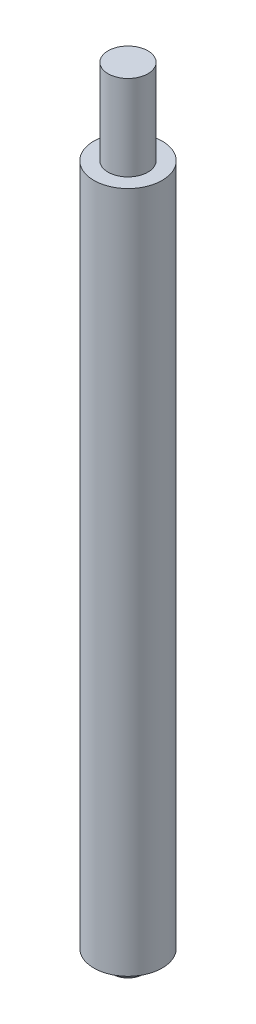
ISO-10303-21;
HEADER;
FILE_DESCRIPTION(('STEP AP214'),'2;1');
FILE_NAME('part.step','',(''),(''),'','','');
FILE_SCHEMA(('AUTOMOTIVE_DESIGN { 1 0 10303 214 1 1 1 1 }'));
ENDSEC;
DATA;
#1=APPLICATION_CONTEXT('core data for automotive mechanical design processes');
#2=APPLICATION_PROTOCOL_DEFINITION('international standard','automotive_design',2000,#1);
#3=PRODUCT_CONTEXT('',#1,'mechanical');
#4=PRODUCT('Part','Part','',(#3));
#5=PRODUCT_RELATED_PRODUCT_CATEGORY('part','',(#4));
#6=PRODUCT_DEFINITION_FORMATION('','',#4);
#7=PRODUCT_DEFINITION_CONTEXT('part definition',#1,'design');
#8=PRODUCT_DEFINITION('design','',#6,#7);
#9=PRODUCT_DEFINITION_SHAPE('','',#8);
#10=(LENGTH_UNIT() NAMED_UNIT(*) SI_UNIT(.MILLI.,.METRE.));
#11=(NAMED_UNIT(*) PLANE_ANGLE_UNIT() SI_UNIT($,.RADIAN.));
#12=(NAMED_UNIT(*) SI_UNIT($,.STERADIAN.) SOLID_ANGLE_UNIT());
#13=UNCERTAINTY_MEASURE_WITH_UNIT(LENGTH_MEASURE(1.E-05),#10,'distance_accuracy_value','');
#14=(GEOMETRIC_REPRESENTATION_CONTEXT(3) GLOBAL_UNCERTAINTY_ASSIGNED_CONTEXT((#13)) GLOBAL_UNIT_ASSIGNED_CONTEXT((#10,
#11,#12)) REPRESENTATION_CONTEXT('',''));
#15=CARTESIAN_POINT('',(0.,0.,0.));
#16=DIRECTION('',(0.,0.,1.));
#17=DIRECTION('',(1.,0.,0.));
#18=AXIS2_PLACEMENT_3D('',#15,#16,#17);
#19=CARTESIAN_POINT('',(-95.0254847573724,-22.870352222622,65.857887374483));
#20=DIRECTION('',(0.,1.,0.));
#21=DIRECTION('',(1.,0.,0.));
#22=AXIS2_PLACEMENT_3D('',#19,#20,#21);
#23=PLANE('',#22);
#24=CARTESIAN_POINT('',(-96.4993088756468,-22.8703522226221,69.5601967521078));
#25=CARTESIAN_POINT('',(-96.5119182137897,-22.8703522226221,69.6283260623005));
#26=CARTESIAN_POINT('',(-96.5126447232363,-22.8703522226221,69.6981958552125));
#27=CARTESIAN_POINT('',(-96.5013891171157,-22.8703522226221,69.766694150277));
#28=CARTESIAN_POINT('',(-96.4887204753378,-22.8703522226221,69.8437917630821));
#29=CARTESIAN_POINT('',(-96.4611145755664,-22.870352222622,69.9176780129497));
#30=CARTESIAN_POINT('',(-96.420124706718,-22.870352222622,69.9841938734458));
#31=CARTESIAN_POINT('',(-96.3791366268463,-22.870352222622,70.0507068308996));
#32=CARTESIAN_POINT('',(-96.3255494429534,-22.870352222622,70.1085782849579));
#33=CARTESIAN_POINT('',(-96.2623787646729,-22.870352222622,70.1545505995797));
#34=CARTESIAN_POINT('',(-96.1992097014033,-22.870352222622,70.2005217388812));
#35=CARTESIAN_POINT('',(-96.1276656605427,-22.870352222622,70.2337151931212));
#36=CARTESIAN_POINT('',(-96.0517731678732,-22.870352222622,70.2522624762642));
#37=CARTESIAN_POINT('',(-95.9758801597334,-22.870352222622,70.2708098853825));
#38=CARTESIAN_POINT('',(-95.8970901625167,-22.870352222622,70.2743561858513));
#39=CARTESIAN_POINT('',(-95.8198377448015,-22.870352222622,70.2627019582364));
#40=CARTESIAN_POINT('',(-95.7425825864555,-22.870352222622,70.2510473171724));
#41=CARTESIAN_POINT('',(-95.6683426806989,-22.870352222622,70.2244139848138));
#42=CARTESIAN_POINT('',(-95.6012964888886,-22.870352222622,70.1843015788666));
#43=CARTESIAN_POINT('',(-95.5342473279139,-22.870352222622,70.1441873965273));
#44=CARTESIAN_POINT('',(-95.4756747151514,-22.8703522226219,70.0913600744771));
#45=CARTESIAN_POINT('',(-95.4288752144154,-22.8703522226219,70.0287936940427));
#46=CARTESIAN_POINT('',(-95.3820744071731,-22.8703522226219,69.9662255669365));
#47=CARTESIAN_POINT('',(-95.3479421740751,-22.870352222622,69.8951141157626));
#48=CARTESIAN_POINT('',(-95.3283995403086,-22.870352222622,69.8194624435776));
#49=CARTESIAN_POINT('',(-95.3249030801038,-22.870352222622,69.8059272638069));
#50=CARTESIAN_POINT('',(-95.3218855975252,-22.870352222622,69.7922930437312));
#51=CARTESIAN_POINT('',(-95.3193485698068,-22.870352222622,69.7785851698655));
#52=B_SPLINE_CURVE_WITH_KNOTS('',3,(#24,#25,#26,#27,#28,#29,#30,#31,#32,#33,#34,#35,#36,#37,#38,
#39,#40,#41,#42,#43,#44,#45,#46,#47,#48,#49,#50,#51),.UNSPECIFIED.,.F.,.F.,(4,3,3,3,3,3,3,3,3,
4),(0.122913108078956,0.143738148295298,0.167177576761912,0.190615982229644,0.214053788475091,
0.237491753912711,0.260930550842927,0.284370385768576,0.307810875066373,0.312004718075993),.UNSPECIFIED.);
#53=CARTESIAN_POINT('',(-96.4993088913655,-22.8703522226221,69.5601967491986));
#54=VERTEX_POINT('',#53);
#55=CARTESIAN_POINT('',(-95.3193485186318,-22.8703522226219,69.7785851793369));
#56=VERTEX_POINT('',#55);
#57=EDGE_CURVE('P0_E11',#54,#56,#52,.T.);
#58=ORIENTED_EDGE('',*,*,#57,.T.);
#59=CARTESIAN_POINT('',(-95.3193485698068,-22.870352222622,69.7785851698655));
#60=CARTESIAN_POINT('',(-95.3077055531853,-22.8703522226221,69.7156765141528));
#61=CARTESIAN_POINT('',(-95.3061814341802,-22.8703522226221,69.6512166301712));
#62=CARTESIAN_POINT('',(-95.3149189937312,-22.8703522226221,69.5876592322493));
#63=CARTESIAN_POINT('',(-95.325560100473,-22.8703522226221,69.5102553471511));
#64=CARTESIAN_POINT('',(-95.3512176832514,-22.870352222622,69.4356697244079));
#65=CARTESIAN_POINT('',(-95.3904480919964,-22.870352222622,69.368100778288));
#66=CARTESIAN_POINT('',(-95.3983849296513,-22.870352222622,69.3544306745846));
#67=CARTESIAN_POINT('',(-95.4068465961956,-22.870352222622,69.3411006397397));
#68=CARTESIAN_POINT('',(-95.4158088196716,-22.870352222622,69.3281382906052));
#69=B_SPLINE_CURVE_WITH_KNOTS('',3,(#59,#60,#61,#62,#63,#64,#65,#66,#67,#68),.UNSPECIFIED.,.F.,
.F.,(4,3,3,4),(0.312004718075993,0.331251249565046,0.354690791783998,0.359432925431089),.UNSPECIFIED.);
#70=CARTESIAN_POINT('',(-95.4158088196715,-22.8703522226219,69.3281382906055));
#71=VERTEX_POINT('',#70);
#72=EDGE_CURVE('P0_E31',#56,#71,#69,.T.);
#73=ORIENTED_EDGE('',*,*,#72,.T.);
#74=CARTESIAN_POINT('',(-95.4158088196716,-22.870352222622,69.3281382906052));
#75=CARTESIAN_POINT('',(-95.4511432769944,-22.870352222622,69.2770329400729));
#76=CARTESIAN_POINT('',(-95.494259259355,-22.870352222622,69.2316434983798));
#77=CARTESIAN_POINT('',(-95.5436694952468,-22.870352222622,69.193662588086));
#78=CARTESIAN_POINT('',(-95.5787399073648,-22.870352222622,69.1667044861345));
#79=CARTESIAN_POINT('',(-95.616684221147,-22.870352222622,69.1437072351719));
#80=CARTESIAN_POINT('',(-95.6568101550883,-22.870352222622,69.1250905178238));
#81=CARTESIAN_POINT('',(-95.6969359145265,-22.870352222622,69.1064738814377));
#82=CARTESIAN_POINT('',(-95.7389976619471,-22.870352222622,69.0923516951816));
#83=CARTESIAN_POINT('',(-95.7822279534295,-22.870352222622,69.0829816673559));
#84=CARTESIAN_POINT('',(-95.8585815950127,-22.870352222622,69.0664322590197));
#85=CARTESIAN_POINT('',(-95.9374375560842,-22.870352222622,69.0649548718452));
#86=CARTESIAN_POINT('',(-96.0143575687471,-22.870352222622,69.0786324303592));
#87=CARTESIAN_POINT('',(-96.0912805858234,-22.870352222622,69.0923105231039));
#88=CARTESIAN_POINT('',(-96.1647962822391,-22.870352222622,69.1208831277757));
#89=CARTESIAN_POINT('',(-96.2307669669943,-22.870352222622,69.1627414203146));
#90=CARTESIAN_POINT('',(-96.2967406132708,-22.870352222622,69.2046015919339));
#91=CARTESIAN_POINT('',(-96.3539069678558,-22.870352222622,69.2589481447));
#92=CARTESIAN_POINT('',(-96.3990486065563,-22.870352222622,69.3227214617438));
#93=CARTESIAN_POINT('',(-96.4441913545155,-22.870352222622,69.3864963458796));
#94=CARTESIAN_POINT('',(-96.4764457188308,-22.8703522226221,69.45847914577));
#95=CARTESIAN_POINT('',(-96.4939963267554,-22.8703522226221,69.5346177246058));
#96=CARTESIAN_POINT('',(-96.4959544488244,-22.8703522226221,69.5431125090693));
#97=CARTESIAN_POINT('',(-96.4977253640026,-22.8703522226221,69.5516409060529));
#98=CARTESIAN_POINT('',(-96.4993088756468,-22.8703522226221,69.5601967521078));
#99=B_SPLINE_CURVE_WITH_KNOTS('',3,(#74,#75,#76,#77,#78,#79,#80,#81,#82,#83,#84,#85,#86,#87,#88,
#89,#90,#91,#92,#93,#94,#95,#96,#97,#98),.UNSPECIFIED.,.F.,.F.,(4,3,3,3,3,3,3,3,4),
(-0.0186963334957931,0.,0.0132702892216495,0.0265405207323562,0.0499784959518487,
0.0734173866335823,0.0968573295216872,0.120297848395959,0.122913108078956),.UNSPECIFIED.);
#100=EDGE_CURVE('P0_E52',#71,#54,#99,.T.);
#101=ORIENTED_EDGE('',*,*,#100,.T.);
#102=EDGE_LOOP('',(#58,#73,#101));
#103=FACE_BOUND('',#102,.T.);
#104=ADVANCED_FACE('P0_F17',(#103),#23,.T.);
#105=CARTESIAN_POINT('',(-95.4158088196716,-22.870352222622,69.3281382906052));
#106=CARTESIAN_POINT('',(-95.4158088196716,-34.870352222622,69.3281382906052));
#107=CARTESIAN_POINT('',(-95.4068465961956,-22.870352222622,69.3411006397397));
#108=CARTESIAN_POINT('',(-95.4068465961956,-34.870352222622,69.3411006397397));
#109=CARTESIAN_POINT('',(-95.3983849296513,-22.870352222622,69.3544306745846));
#110=CARTESIAN_POINT('',(-95.3983849296513,-34.870352222622,69.3544306745846));
#111=CARTESIAN_POINT('',(-95.3512176832514,-22.870352222622,69.4356697244079));
#112=CARTESIAN_POINT('',(-95.3512176832514,-34.870352222622,69.4356697244079));
#113=CARTESIAN_POINT('',(-95.325560100473,-22.8703522226221,69.5102553471511));
#114=CARTESIAN_POINT('',(-95.325560100473,-34.8703522226221,69.5102553471511));
#115=CARTESIAN_POINT('',(-95.3042775091502,-22.8703522226221,69.6650658657665));
#116=CARTESIAN_POINT('',(-95.3042775091502,-34.8703522226221,69.6650658657665));
#117=CARTESIAN_POINT('',(-95.3088570022515,-22.870352222622,69.7438111418945));
#118=CARTESIAN_POINT('',(-95.3088570022515,-34.870352222622,69.7438111418945));
#119=CARTESIAN_POINT('',(-95.3479421740751,-22.870352222622,69.8951141157626));
#120=CARTESIAN_POINT('',(-95.3479421740751,-34.870352222622,69.8951141157626));
#121=CARTESIAN_POINT('',(-95.3820744071731,-22.8703522226219,69.9662255669365));
#122=CARTESIAN_POINT('',(-95.3820744071731,-34.8703522226219,69.9662255669365));
#123=CARTESIAN_POINT('',(-95.4756747151514,-22.8703522226219,70.0913600744771));
#124=CARTESIAN_POINT('',(-95.4756747151514,-34.8703522226219,70.0913600744771));
#125=CARTESIAN_POINT('',(-95.5342473279139,-22.870352222622,70.1441873965273));
#126=CARTESIAN_POINT('',(-95.5342473279139,-34.870352222622,70.1441873965273));
#127=CARTESIAN_POINT('',(-95.6683426806989,-22.870352222622,70.2244139848138));
#128=CARTESIAN_POINT('',(-95.6683426806989,-34.870352222622,70.2244139848138));
#129=CARTESIAN_POINT('',(-95.7425825864555,-22.870352222622,70.2510473171724));
#130=CARTESIAN_POINT('',(-95.7425825864555,-34.870352222622,70.2510473171724));
#131=CARTESIAN_POINT('',(-95.8970901625167,-22.870352222622,70.2743561858513));
#132=CARTESIAN_POINT('',(-95.8970901625167,-34.870352222622,70.2743561858513));
#133=CARTESIAN_POINT('',(-95.9758801597334,-22.870352222622,70.2708098853825));
#134=CARTESIAN_POINT('',(-95.9758801597334,-34.870352222622,70.2708098853825));
#135=CARTESIAN_POINT('',(-96.1276656605427,-22.870352222622,70.2337151931212));
#136=CARTESIAN_POINT('',(-96.1276656605427,-34.870352222622,70.2337151931212));
#137=CARTESIAN_POINT('',(-96.1992097014033,-22.870352222622,70.2005217388812));
#138=CARTESIAN_POINT('',(-96.1992097014033,-34.870352222622,70.2005217388812));
#139=CARTESIAN_POINT('',(-96.3255494429534,-22.870352222622,70.1085782849579));
#140=CARTESIAN_POINT('',(-96.3255494429534,-34.870352222622,70.1085782849579));
#141=CARTESIAN_POINT('',(-96.3791366268463,-22.870352222622,70.0507068308996));
#142=CARTESIAN_POINT('',(-96.3791366268463,-34.870352222622,70.0507068308996));
#143=CARTESIAN_POINT('',(-96.4611145755664,-22.870352222622,69.9176780129497));
#144=CARTESIAN_POINT('',(-96.4611145755664,-34.870352222622,69.9176780129497));
#145=CARTESIAN_POINT('',(-96.4887204753378,-22.8703522226221,69.8437917630821));
#146=CARTESIAN_POINT('',(-96.4887204753378,-34.8703522226221,69.8437917630821));
#147=CARTESIAN_POINT('',(-96.5140582298894,-22.8703522226221,69.6895936711315));
#148=CARTESIAN_POINT('',(-96.5140582298894,-34.8703522226221,69.6895936711315));
#149=CARTESIAN_POINT('',(-96.5115467707269,-22.8703522226221,69.6107555921758));
#150=CARTESIAN_POINT('',(-96.5115467707269,-34.8703522226221,69.6107555921758));
#151=CARTESIAN_POINT('',(-96.4764457188308,-22.8703522226221,69.45847914577));
#152=CARTESIAN_POINT('',(-96.4764457188308,-34.8703522226221,69.45847914577));
#153=CARTESIAN_POINT('',(-96.4441913545155,-22.870352222622,69.3864963458796));
#154=CARTESIAN_POINT('',(-96.4441913545155,-34.870352222622,69.3864963458796));
#155=CARTESIAN_POINT('',(-96.3539069678558,-22.870352222622,69.2589481447));
#156=CARTESIAN_POINT('',(-96.3539069678558,-34.870352222622,69.2589481447));
#157=CARTESIAN_POINT('',(-96.2967406132708,-22.870352222622,69.2046015919339));
#158=CARTESIAN_POINT('',(-96.2967406132708,-34.870352222622,69.2046015919339));
#159=CARTESIAN_POINT('',(-96.1647962822391,-22.870352222622,69.1208831277757));
#160=CARTESIAN_POINT('',(-96.1647962822391,-34.870352222622,69.1208831277757));
#161=CARTESIAN_POINT('',(-96.0912805858234,-22.870352222622,69.0923105231039));
#162=CARTESIAN_POINT('',(-96.0912805858234,-34.870352222622,69.0923105231039));
#163=CARTESIAN_POINT('',(-95.9374375560842,-22.870352222622,69.0649548718452));
#164=CARTESIAN_POINT('',(-95.9374375560842,-34.870352222622,69.0649548718452));
#165=CARTESIAN_POINT('',(-95.8585815950127,-22.870352222622,69.0664322590197));
#166=CARTESIAN_POINT('',(-95.8585815950127,-34.870352222622,69.0664322590197));
#167=CARTESIAN_POINT('',(-95.7389976619471,-22.870352222622,69.0923516951816));
#168=CARTESIAN_POINT('',(-95.7389976619471,-34.870352222622,69.0923516951816));
#169=CARTESIAN_POINT('',(-95.6969359145265,-22.870352222622,69.1064738814377));
#170=CARTESIAN_POINT('',(-95.6969359145265,-34.870352222622,69.1064738814377));
#171=CARTESIAN_POINT('',(-95.616684221147,-22.870352222622,69.1437072351719));
#172=CARTESIAN_POINT('',(-95.616684221147,-34.870352222622,69.1437072351719));
#173=CARTESIAN_POINT('',(-95.5787399073648,-22.870352222622,69.1667044861345));
#174=CARTESIAN_POINT('',(-95.5787399073648,-34.870352222622,69.1667044861345));
#175=CARTESIAN_POINT('',(-95.5436694952468,-22.870352222622,69.193662588086));
#176=CARTESIAN_POINT('',(-95.5436694952468,-34.870352222622,69.193662588086));
#177=CARTESIAN_POINT('',(-95.494259259355,-22.870352222622,69.2316434983798));
#178=CARTESIAN_POINT('',(-95.494259259355,-34.870352222622,69.2316434983798));
#179=CARTESIAN_POINT('',(-95.4511432769944,-22.870352222622,69.2770329400729));
#180=CARTESIAN_POINT('',(-95.4511432769944,-34.870352222622,69.2770329400729));
#181=CARTESIAN_POINT('',(-95.4158088196716,-22.870352222622,69.3281382906052));
#182=CARTESIAN_POINT('',(-95.4158088196716,-34.870352222622,69.3281382906052));
#183=B_SPLINE_SURFACE_WITH_KNOTS('',3,1,((#105,#106),(#107,#108),(#109,#110),(#111,#112),(#113,
#114),(#115,#116),(#117,#118),(#119,#120),(#121,#122),(#123,#124),(#125,#126),(#127,#128),(#129,
#130),(#131,#132),(#133,#134),(#135,#136),(#137,#138),(#139,#140),(#141,#142),(#143,#144),(#145,
#146),(#147,#148),(#149,#150),(#151,#152),(#153,#154),(#155,#156),(#157,#158),(#159,#160),(#161,
#162),(#163,#164),(#165,#166),(#167,#168),(#169,#170),(#171,#172),(#173,#174),(#175,#176),(#177,
#178),(#179,#180),(#181,#182)),.UNSPECIFIED.,.T.,.F.,.F.,(4,2,2,2,2,2,2,2,2,2,2,2,2,2,2,2,2,3,
4),(2,2),(-0.359432925431089,-0.354690791783998,-0.331251249565046,-0.307810875066373,
-0.284370385768576,-0.260930550842927,-0.237491753912711,-0.214053788475091,-0.190615982229644,
-0.167177576761912,-0.143738148295298,-0.120297848395959,-0.0968573295216872,
-0.0734173866335823,-0.0499784959518487,-0.0265405207323562,-0.0132702892216495,0.,
0.0186963334957931),(0.,1.2),.UNSPECIFIED.);
#184=CARTESIAN_POINT('',(-95.4158088196716,-34.870352222622,69.3281382906052));
#185=CARTESIAN_POINT('',(-95.4068465961956,-34.870352222622,69.3411006397397));
#186=CARTESIAN_POINT('',(-95.3983849296513,-34.870352222622,69.3544306745846));
#187=CARTESIAN_POINT('',(-95.3904480919964,-34.870352222622,69.368100778288));
#188=CARTESIAN_POINT('',(-95.3512176832514,-34.870352222622,69.4356697244079));
#189=CARTESIAN_POINT('',(-95.325560100473,-34.8703522226221,69.5102553471511));
#190=CARTESIAN_POINT('',(-95.3149189937312,-34.8703522226221,69.5876592322493));
#191=CARTESIAN_POINT('',(-95.3042775091502,-34.8703522226221,69.6650658657665));
#192=CARTESIAN_POINT('',(-95.3088570022515,-34.870352222622,69.7438111418945));
#193=CARTESIAN_POINT('',(-95.3283995403086,-34.870352222622,69.8194624435776));
#194=CARTESIAN_POINT('',(-95.3479421740751,-34.870352222622,69.8951141157626));
#195=CARTESIAN_POINT('',(-95.3820744071731,-34.8703522226219,69.9662255669365));
#196=CARTESIAN_POINT('',(-95.4288752144154,-34.8703522226219,70.0287936940427));
#197=CARTESIAN_POINT('',(-95.4756747151514,-34.8703522226219,70.0913600744771));
#198=CARTESIAN_POINT('',(-95.5342473279139,-34.870352222622,70.1441873965273));
#199=CARTESIAN_POINT('',(-95.6012964888886,-34.870352222622,70.1843015788666));
#200=CARTESIAN_POINT('',(-95.6683426806989,-34.870352222622,70.2244139848138));
#201=CARTESIAN_POINT('',(-95.7425825864555,-34.870352222622,70.2510473171724));
#202=CARTESIAN_POINT('',(-95.8198377448015,-34.870352222622,70.2627019582364));
#203=CARTESIAN_POINT('',(-95.8970901625167,-34.870352222622,70.2743561858513));
#204=CARTESIAN_POINT('',(-95.9758801597334,-34.870352222622,70.2708098853825));
#205=CARTESIAN_POINT('',(-96.0517731678732,-34.870352222622,70.2522624762642));
#206=CARTESIAN_POINT('',(-96.1276656605427,-34.870352222622,70.2337151931212));
#207=CARTESIAN_POINT('',(-96.1992097014033,-34.870352222622,70.2005217388812));
#208=CARTESIAN_POINT('',(-96.2623787646729,-34.870352222622,70.1545505995797));
#209=CARTESIAN_POINT('',(-96.3255494429534,-34.870352222622,70.1085782849579));
#210=CARTESIAN_POINT('',(-96.3791366268463,-34.870352222622,70.0507068308996));
#211=CARTESIAN_POINT('',(-96.420124706718,-34.870352222622,69.9841938734458));
#212=CARTESIAN_POINT('',(-96.4611145755664,-34.870352222622,69.9176780129497));
#213=CARTESIAN_POINT('',(-96.4887204753378,-34.8703522226221,69.8437917630821));
#214=CARTESIAN_POINT('',(-96.5013891171157,-34.8703522226221,69.766694150277));
#215=CARTESIAN_POINT('',(-96.5140582298894,-34.8703522226221,69.6895936711315));
#216=CARTESIAN_POINT('',(-96.5115467707269,-34.8703522226221,69.6107555921758));
#217=CARTESIAN_POINT('',(-96.4939963267554,-34.8703522226221,69.5346177246058));
#218=CARTESIAN_POINT('',(-96.4764457188308,-34.8703522226221,69.45847914577));
#219=CARTESIAN_POINT('',(-96.4441913545155,-34.870352222622,69.3864963458796));
#220=CARTESIAN_POINT('',(-96.3990486065563,-34.870352222622,69.3227214617438));
#221=CARTESIAN_POINT('',(-96.3539069678558,-34.870352222622,69.2589481447));
#222=CARTESIAN_POINT('',(-96.2967406132708,-34.870352222622,69.2046015919339));
#223=CARTESIAN_POINT('',(-96.2307669669943,-34.870352222622,69.1627414203146));
#224=CARTESIAN_POINT('',(-96.1647962822391,-34.870352222622,69.1208831277757));
#225=CARTESIAN_POINT('',(-96.0912805858234,-34.870352222622,69.0923105231039));
#226=CARTESIAN_POINT('',(-96.0143575687471,-34.870352222622,69.0786324303592));
#227=CARTESIAN_POINT('',(-95.9374375560842,-34.870352222622,69.0649548718452));
#228=CARTESIAN_POINT('',(-95.8585815950127,-34.870352222622,69.0664322590197));
#229=CARTESIAN_POINT('',(-95.7822279534295,-34.870352222622,69.0829816673559));
#230=CARTESIAN_POINT('',(-95.7389976619471,-34.870352222622,69.0923516951816));
#231=CARTESIAN_POINT('',(-95.6969359145265,-34.870352222622,69.1064738814377));
#232=CARTESIAN_POINT('',(-95.6568101550883,-34.870352222622,69.1250905178238));
#233=CARTESIAN_POINT('',(-95.616684221147,-34.870352222622,69.1437072351719));
#234=CARTESIAN_POINT('',(-95.5787399073648,-34.870352222622,69.1667044861345));
#235=CARTESIAN_POINT('',(-95.5436694952468,-34.870352222622,69.193662588086));
#236=CARTESIAN_POINT('',(-95.494259259355,-34.870352222622,69.2316434983798));
#237=CARTESIAN_POINT('',(-95.4511432769944,-34.870352222622,69.2770329400729));
#238=CARTESIAN_POINT('',(-95.4158088196716,-34.870352222622,69.3281382906052));
#239=B_SPLINE_CURVE_WITH_KNOTS('',3,(#184,#185,#186,#187,#188,#189,#190,#191,#192,#193,#194,
#195,#196,#197,#198,#199,#200,#201,#202,#203,#204,#205,#206,#207,#208,#209,#210,#211,#212,#213,
#214,#215,#216,#217,#218,#219,#220,#221,#222,#223,#224,#225,#226,#227,#228,#229,#230,#231,#232,
#233,#234,#235,#236,#237,#238),.UNSPECIFIED.,.T.,.F.,(4,3,3,3,3,3,3,3,3,3,3,3,3,3,3,3,3,3,4),
(-0.359432925431089,-0.354690791783998,-0.331251249565046,-0.307810875066373,-0.284370385768576,
-0.260930550842927,-0.237491753912711,-0.214053788475091,-0.190615982229644,-0.167177576761912,
-0.143738148295298,-0.120297848395959,-0.0968573295216872,-0.0734173866335823,
-0.0499784959518487,-0.0265405207323562,-0.0132702892216495,0.,0.0186963334957931),.UNSPECIFIED.);
#240=CARTESIAN_POINT('',(-95.4158088196716,-34.870352222622,69.3281382906052));
#241=VERTEX_POINT('',#240);
#242=EDGE_CURVE('P0_E23',#241,#241,#239,.T.);
#243=ORIENTED_EDGE('',*,*,#242,.F.);
#244=EDGE_LOOP('',(#243));
#245=FACE_BOUND('',#244,.T.);
#246=ORIENTED_EDGE('',*,*,#100,.F.);
#247=ORIENTED_EDGE('',*,*,#72,.F.);
#248=ORIENTED_EDGE('',*,*,#57,.F.);
#249=EDGE_LOOP('',(#246,#247,#248));
#250=FACE_BOUND('',#249,.T.);
#251=ADVANCED_FACE('P0_F19',(#245,#250),#183,.T.);
#252=CARTESIAN_POINT('',(-95.1828071834293,-34.870352222622,65.9186913955159));
#253=DIRECTION('',(0.,1.,0.));
#254=DIRECTION('',(1.,0.,0.));
#255=AXIS2_PLACEMENT_3D('',#252,#253,#254);
#256=PLANE('',#255);
#257=ORIENTED_EDGE('',*,*,#242,.T.);
#258=EDGE_LOOP('',(#257));
#259=FACE_BOUND('',#258,.T.);
#260=ADVANCED_FACE('P0_F80',(#259),#256,.F.);
#261=CLOSED_SHELL('',(#104,#251,#260));
#262=MANIFOLD_SOLID_BREP('P0_B1',#261);
#263=CARTESIAN_POINT('',(-81.665808000505,-21.3703528404236,27.730238100206));
#264=DIRECTION('',(0.,1.,0.));
#265=DIRECTION('',(0.,0.,-1.));
#266=AXIS2_PLACEMENT_3D('',#263,#264,#265);
#267=PLANE('',#266);
#268=CARTESIAN_POINT('',(-95.9093287049987,-21.3703528404236,69.6693909642677));
#269=DIRECTION('',(0.,1.,0.));
#270=DIRECTION('',(2.1425115015461E-09,0.,1.));
#271=AXIS2_PLACEMENT_3D('',#268,#269,#270);
#272=CIRCLE('',#271,0.35);
#273=CARTESIAN_POINT('',(-95.9093287042488,-21.3703528404236,70.0193909642677));
#274=VERTEX_POINT('',#273);
#275=EDGE_CURVE('P1_E10',#274,#274,#272,.T.);
#276=ORIENTED_EDGE('',*,*,#275,.T.);
#277=EDGE_LOOP('',(#276));
#278=FACE_BOUND('',#277,.T.);
#279=ADVANCED_FACE('P1_F15',(#278),#267,.T.);
#280=CARTESIAN_POINT('',(-95.9093287049987,-22.8703528404236,69.6693909642677));
#281=DIRECTION('',(0.,1.,0.));
#282=DIRECTION('',(2.1425115015461E-09,0.,1.));
#283=AXIS2_PLACEMENT_3D('',#280,#281,#282);
#284=CYLINDRICAL_SURFACE('',#283,0.35);
#285=CARTESIAN_POINT('',(-95.9093287049987,-34.9703528404236,69.6693909642677));
#286=DIRECTION('',(0.,-1.,0.));
#287=DIRECTION('',(2.14248936052691E-09,0.,1.));
#288=AXIS2_PLACEMENT_3D('',#285,#286,#287);
#289=CIRCLE('',#288,0.35);
#290=CARTESIAN_POINT('',(-95.9093287042488,-34.9703528404236,70.0193909642677));
#291=VERTEX_POINT('',#290);
#292=EDGE_CURVE('P1_E23',#291,#291,#289,.T.);
#293=ORIENTED_EDGE('',*,*,#292,.F.);
#294=EDGE_LOOP('',(#293));
#295=FACE_BOUND('',#294,.T.);
#296=ORIENTED_EDGE('',*,*,#275,.F.);
#297=EDGE_LOOP('',(#296));
#298=FACE_BOUND('',#297,.T.);
#299=ADVANCED_FACE('P1_F49',(#295,#298),#284,.T.);
#300=CARTESIAN_POINT('',(-81.665808000505,-35.1703528404236,27.730238100206));
#301=DIRECTION('',(0.,1.,0.));
#302=DIRECTION('',(0.,0.,-1.));
#303=AXIS2_PLACEMENT_3D('',#300,#301,#302);
#304=PLANE('',#303);
#305=CARTESIAN_POINT('',(-95.9093287049987,-35.1703528404236,69.6693909642677));
#306=DIRECTION('',(0.,1.,0.));
#307=DIRECTION('',(2.14248936052691E-09,0.,1.));
#308=AXIS2_PLACEMENT_3D('',#305,#306,#307);
#309=CIRCLE('',#308,0.15);
#310=CARTESIAN_POINT('',(-95.9093287046773,-35.1703528404236,69.8193909642677));
#311=VERTEX_POINT('',#310);
#312=EDGE_CURVE('P1_E33',#311,#311,#309,.T.);
#313=ORIENTED_EDGE('',*,*,#312,.F.);
#314=EDGE_LOOP('',(#313));
#315=FACE_BOUND('',#314,.T.);
#316=ADVANCED_FACE('P1_F47',(#315),#304,.F.);
#317=CARTESIAN_POINT('',(-95.9093287049987,-34.9703528404237,69.6693909642677));
#318=DIRECTION('',(0.,-1.,0.));
#319=DIRECTION('',(1.,0.,0.));
#320=AXIS2_PLACEMENT_3D('',#317,#318,#319);
#321=DEGENERATE_TOROIDAL_SURFACE('',#320,0.150000000000039,0.199999999999964,.T.);
#322=ORIENTED_EDGE('',*,*,#292,.T.);
#323=EDGE_LOOP('',(#322));
#324=FACE_BOUND('',#323,.T.);
#325=ORIENTED_EDGE('',*,*,#312,.T.);
#326=EDGE_LOOP('',(#325));
#327=FACE_BOUND('',#326,.T.);
#328=ADVANCED_FACE('P1_F17',(#324,#327),#321,.T.);
#329=CLOSED_SHELL('',(#279,#299,#316,#328));
#330=MANIFOLD_SOLID_BREP('P1_B1',#329);
#331=ADVANCED_BREP_SHAPE_REPRESENTATION('',(#18,#262,#330),#14);
#332=SHAPE_DEFINITION_REPRESENTATION(#9,#331);
ENDSEC;
END-ISO-10303-21;
